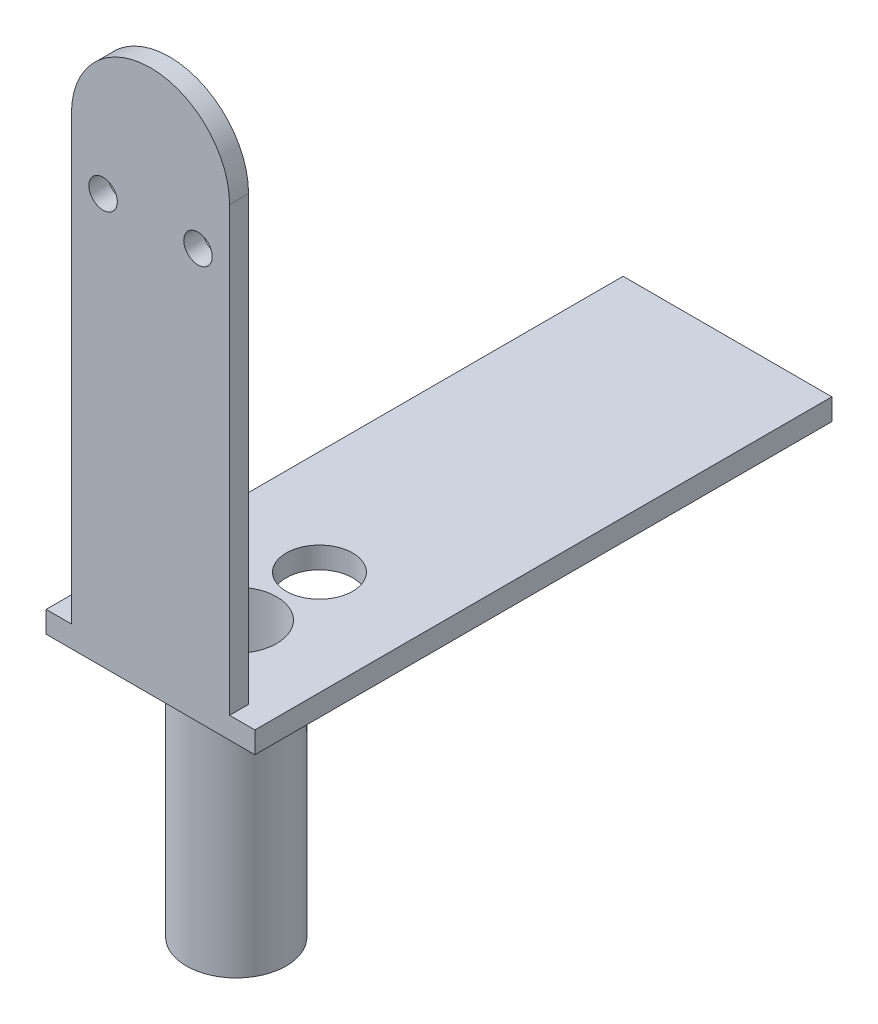
ISO-10303-21;
HEADER;
FILE_DESCRIPTION(('STEP AP214'),'2;1');
FILE_NAME('part.step','',(''),(''),'','','');
FILE_SCHEMA(('AUTOMOTIVE_DESIGN { 1 0 10303 214 1 1 1 1 }'));
ENDSEC;
DATA;
#1=APPLICATION_CONTEXT('core data for automotive mechanical design processes');
#2=APPLICATION_PROTOCOL_DEFINITION('international standard','automotive_design',2000,#1);
#3=PRODUCT_CONTEXT('',#1,'mechanical');
#4=PRODUCT('Part','Part','',(#3));
#5=PRODUCT_RELATED_PRODUCT_CATEGORY('part','',(#4));
#6=PRODUCT_DEFINITION_FORMATION('','',#4);
#7=PRODUCT_DEFINITION_CONTEXT('part definition',#1,'design');
#8=PRODUCT_DEFINITION('design','',#6,#7);
#9=PRODUCT_DEFINITION_SHAPE('','',#8);
#10=(LENGTH_UNIT() NAMED_UNIT(*) SI_UNIT(.MILLI.,.METRE.));
#11=(NAMED_UNIT(*) PLANE_ANGLE_UNIT() SI_UNIT($,.RADIAN.));
#12=(NAMED_UNIT(*) SI_UNIT($,.STERADIAN.) SOLID_ANGLE_UNIT());
#13=UNCERTAINTY_MEASURE_WITH_UNIT(LENGTH_MEASURE(1.E-05),#10,'distance_accuracy_value','');
#14=(GEOMETRIC_REPRESENTATION_CONTEXT(3) GLOBAL_UNCERTAINTY_ASSIGNED_CONTEXT((#13)) GLOBAL_UNIT_ASSIGNED_CONTEXT((#10,
#11,#12)) REPRESENTATION_CONTEXT('',''));
#15=CARTESIAN_POINT('',(0.,0.,0.));
#16=DIRECTION('',(0.,0.,1.));
#17=DIRECTION('',(1.,0.,0.));
#18=AXIS2_PLACEMENT_3D('',#15,#16,#17);
#19=CARTESIAN_POINT('',(0.,102.88672710634,0.));
#20=DIRECTION('',(-1.,0.,0.));
#21=DIRECTION('',(0.,0.,1.));
#22=AXIS2_PLACEMENT_3D('',#19,#20,#21);
#23=PLANE('',#22);
#24=DIRECTION('',(0.,0.,1.));
#25=VECTOR('',#24,1.);
#26=CARTESIAN_POINT('',(0.,10.6,0.));
#27=LINE('',#26,#25);
#28=CARTESIAN_POINT('',(0.,10.6,-75.2));
#29=VERTEX_POINT('',#28);
#30=CARTESIAN_POINT('',(0.,10.6,16.));
#31=VERTEX_POINT('',#30);
#32=EDGE_CURVE('E112',#29,#31,#27,.T.);
#33=ORIENTED_EDGE('',*,*,#32,.F.);
#34=DIRECTION('',(0.,1.,0.));
#35=VECTOR('',#34,1.);
#36=CARTESIAN_POINT('',(0.,7.2,-75.2));
#37=LINE('',#36,#35);
#38=CARTESIAN_POINT('',(0.,7.2,-75.2));
#39=VERTEX_POINT('',#38);
#40=EDGE_CURVE('E166',#39,#29,#37,.T.);
#41=ORIENTED_EDGE('',*,*,#40,.F.);
#42=DIRECTION('',(0.,0.,-1.));
#43=VECTOR('',#42,1.);
#44=CARTESIAN_POINT('',(0.,7.2,16.));
#45=LINE('',#44,#43);
#46=CARTESIAN_POINT('',(0.,7.2,16.));
#47=VERTEX_POINT('',#46);
#48=EDGE_CURVE('E140',#47,#39,#45,.T.);
#49=ORIENTED_EDGE('',*,*,#48,.F.);
#50=DIRECTION('',(0.,-1.,0.));
#51=VECTOR('',#50,1.);
#52=CARTESIAN_POINT('',(0.,102.88672710634,16.));
#53=LINE('',#52,#51);
#54=EDGE_CURVE('E118',#31,#47,#53,.T.);
#55=ORIENTED_EDGE('',*,*,#54,.F.);
#56=EDGE_LOOP('',(#33,#41,#49,#55));
#57=FACE_BOUND('',#56,.T.);
#58=ADVANCED_FACE('F37',(#57),#23,.T.);
#59=CARTESIAN_POINT('',(33.,102.88672710634,0.));
#60=DIRECTION('',(-1.,0.,0.));
#61=DIRECTION('',(0.,0.,1.));
#62=AXIS2_PLACEMENT_3D('',#59,#60,#61);
#63=PLANE('',#62);
#64=DIRECTION('',(0.,-1.,0.));
#65=VECTOR('',#64,1.);
#66=CARTESIAN_POINT('',(33.,10.6,-75.2));
#67=LINE('',#66,#65);
#68=CARTESIAN_POINT('',(33.,10.6,-75.2));
#69=VERTEX_POINT('',#68);
#70=CARTESIAN_POINT('',(33.,7.2,-75.2));
#71=VERTEX_POINT('',#70);
#72=EDGE_CURVE('E53',#69,#71,#67,.T.);
#73=ORIENTED_EDGE('',*,*,#72,.F.);
#74=DIRECTION('',(0.,0.,1.));
#75=VECTOR('',#74,1.);
#76=CARTESIAN_POINT('',(33.,10.6,0.));
#77=LINE('',#76,#75);
#78=CARTESIAN_POINT('',(33.,10.6,16.));
#79=VERTEX_POINT('',#78);
#80=EDGE_CURVE('E129',#69,#79,#77,.T.);
#81=ORIENTED_EDGE('',*,*,#80,.T.);
#82=DIRECTION('',(0.,-1.,0.));
#83=VECTOR('',#82,1.);
#84=CARTESIAN_POINT('',(33.,102.88672710634,16.));
#85=LINE('',#84,#83);
#86=CARTESIAN_POINT('',(33.,7.2,16.));
#87=VERTEX_POINT('',#86);
#88=EDGE_CURVE('E130',#79,#87,#85,.T.);
#89=ORIENTED_EDGE('',*,*,#88,.T.);
#90=DIRECTION('',(0.,0.,1.));
#91=VECTOR('',#90,1.);
#92=CARTESIAN_POINT('',(33.,7.2,-76.1999999999999));
#93=LINE('',#92,#91);
#94=EDGE_CURVE('E146',#71,#87,#93,.T.);
#95=ORIENTED_EDGE('',*,*,#94,.F.);
#96=EDGE_LOOP('',(#73,#81,#89,#95));
#97=FACE_BOUND('',#96,.T.);
#98=ADVANCED_FACE('F235',(#97),#63,.F.);
#99=CARTESIAN_POINT('',(0.,10.6,0.));
#100=DIRECTION('',(0.,-1.,0.));
#101=DIRECTION('',(0.,0.,-1.));
#102=AXIS2_PLACEMENT_3D('',#99,#100,#101);
#103=PLANE('',#102);
#104=CARTESIAN_POINT('',(16.5,10.6,-10.7));
#105=DIRECTION('',(0.,-1.,0.));
#106=DIRECTION('',(0.,0.,-1.));
#107=AXIS2_PLACEMENT_3D('',#104,#105,#106);
#108=CIRCLE('',#107,5.25);
#109=CARTESIAN_POINT('',(16.5,10.6,-15.95));
#110=VERTEX_POINT('',#109);
#111=EDGE_CURVE('E133',#110,#110,#108,.F.);
#112=ORIENTED_EDGE('',*,*,#111,.F.);
#113=EDGE_LOOP('',(#112));
#114=FACE_BOUND('',#113,.T.);
#115=CARTESIAN_POINT('',(16.5,10.6,2.45));
#116=DIRECTION('',(0.,-1.,0.));
#117=DIRECTION('',(0.,0.,-1.));
#118=AXIS2_PLACEMENT_3D('',#115,#116,#117);
#119=CIRCLE('',#118,6.4);
#120=CARTESIAN_POINT('',(16.5,10.6,-3.95));
#121=VERTEX_POINT('',#120);
#122=EDGE_CURVE('E154',#121,#121,#119,.F.);
#123=ORIENTED_EDGE('',*,*,#122,.F.);
#124=EDGE_LOOP('',(#123));
#125=FACE_BOUND('',#124,.T.);
#126=DIRECTION('',(1.,0.,0.));
#127=VECTOR('',#126,1.);
#128=CARTESIAN_POINT('',(0.,10.6,-75.2));
#129=LINE('',#128,#127);
#130=EDGE_CURVE('E164',#29,#69,#129,.T.);
#131=ORIENTED_EDGE('',*,*,#130,.F.);
#132=ORIENTED_EDGE('',*,*,#32,.T.);
#133=DIRECTION('',(1.,0.,0.));
#134=VECTOR('',#133,1.);
#135=CARTESIAN_POINT('',(0.,10.6,16.));
#136=LINE('',#135,#134);
#137=CARTESIAN_POINT('',(4.,10.6,16.));
#138=VERTEX_POINT('',#137);
#139=EDGE_CURVE('E117',#31,#138,#136,.T.);
#140=ORIENTED_EDGE('',*,*,#139,.T.);
#141=DIRECTION('',(0.,0.,1.));
#142=VECTOR('',#141,1.);
#143=CARTESIAN_POINT('',(4.,10.6,0.));
#144=LINE('',#143,#142);
#145=CARTESIAN_POINT('',(4.,10.6,13.));
#146=VERTEX_POINT('',#145);
#147=EDGE_CURVE('E115',#146,#138,#144,.T.);
#148=ORIENTED_EDGE('',*,*,#147,.F.);
#149=DIRECTION('',(1.,0.,0.));
#150=VECTOR('',#149,1.);
#151=CARTESIAN_POINT('',(0.,10.6,13.));
#152=LINE('',#151,#150);
#153=CARTESIAN_POINT('',(29.,10.6,13.));
#154=VERTEX_POINT('',#153);
#155=EDGE_CURVE('E88',#146,#154,#152,.T.);
#156=ORIENTED_EDGE('',*,*,#155,.T.);
#157=DIRECTION('',(0.,0.,-1.));
#158=VECTOR('',#157,1.);
#159=CARTESIAN_POINT('',(29.,10.6,0.));
#160=LINE('',#159,#158);
#161=CARTESIAN_POINT('',(29.,10.6,16.));
#162=VERTEX_POINT('',#161);
#163=EDGE_CURVE('E126',#162,#154,#160,.T.);
#164=ORIENTED_EDGE('',*,*,#163,.F.);
#165=DIRECTION('',(-1.,0.,0.));
#166=VECTOR('',#165,1.);
#167=CARTESIAN_POINT('',(0.,10.6,16.));
#168=LINE('',#167,#166);
#169=EDGE_CURVE('E121',#79,#162,#168,.T.);
#170=ORIENTED_EDGE('',*,*,#169,.F.);
#171=ORIENTED_EDGE('',*,*,#80,.F.);
#172=EDGE_LOOP('',(#131,#132,#140,#148,#156,#164,#170,#171));
#173=FACE_BOUND('',#172,.T.);
#174=ADVANCED_FACE('F180',(#114,#125,#173),#103,.F.);
#175=CARTESIAN_POINT('',(0.,7.2,0.));
#176=DIRECTION('',(0.,-1.,0.));
#177=DIRECTION('',(0.,0.,-1.));
#178=AXIS2_PLACEMENT_3D('',#175,#176,#177);
#179=PLANE('',#178);
#180=CARTESIAN_POINT('',(16.5,7.2,-10.7));
#181=DIRECTION('',(0.,-1.,0.));
#182=DIRECTION('',(0.,0.,-1.));
#183=AXIS2_PLACEMENT_3D('',#180,#181,#182);
#184=CIRCLE('',#183,5.25);
#185=CARTESIAN_POINT('',(16.5,7.2,-5.45));
#186=VERTEX_POINT('',#185);
#187=EDGE_CURVE('E41',#186,#186,#184,.F.);
#188=ORIENTED_EDGE('',*,*,#187,.T.);
#189=CARTESIAN_POINT('',(16.5,7.2,2.45));
#190=DIRECTION('',(0.,-1.,0.));
#191=DIRECTION('',(0.,0.,-1.));
#192=AXIS2_PLACEMENT_3D('',#189,#190,#191);
#193=CIRCLE('',#192,7.9);
#194=EDGE_CURVE('E150',#186,#186,#193,.T.);
#195=ORIENTED_EDGE('',*,*,#194,.F.);
#196=EDGE_LOOP('',(#188,#195));
#197=FACE_BOUND('',#196,.T.);
#198=ORIENTED_EDGE('',*,*,#48,.T.);
#199=DIRECTION('',(-1.,0.,0.));
#200=VECTOR('',#199,1.);
#201=CARTESIAN_POINT('',(33.,7.2,-75.2));
#202=LINE('',#201,#200);
#203=EDGE_CURVE('E161',#71,#39,#202,.T.);
#204=ORIENTED_EDGE('',*,*,#203,.F.);
#205=ORIENTED_EDGE('',*,*,#94,.T.);
#206=DIRECTION('',(-1.,0.,0.));
#207=VECTOR('',#206,1.);
#208=CARTESIAN_POINT('',(33.,7.2,16.));
#209=LINE('',#208,#207);
#210=EDGE_CURVE('E143',#87,#47,#209,.T.);
#211=ORIENTED_EDGE('',*,*,#210,.T.);
#212=EDGE_LOOP('',(#198,#204,#205,#211));
#213=FACE_BOUND('',#212,.T.);
#214=ADVANCED_FACE('F213',(#197,#213),#179,.T.);
#215=CARTESIAN_POINT('',(0.,0.,16.));
#216=DIRECTION('',(0.,0.,1.));
#217=DIRECTION('',(1.,0.,0.));
#218=AXIS2_PLACEMENT_3D('',#215,#216,#217);
#219=PLANE('',#218);
#220=CARTESIAN_POINT('',(9.,72.,16.));
#221=DIRECTION('',(0.,0.,1.));
#222=DIRECTION('',(1.,0.,0.));
#223=AXIS2_PLACEMENT_3D('',#220,#221,#222);
#224=CIRCLE('',#223,2.25);
#225=CARTESIAN_POINT('',(6.75,72.,16.));
#226=VERTEX_POINT('',#225);
#227=EDGE_CURVE('E105',#226,#226,#224,.T.);
#228=ORIENTED_EDGE('',*,*,#227,.F.);
#229=EDGE_LOOP('',(#228));
#230=FACE_BOUND('',#229,.T.);
#231=CARTESIAN_POINT('',(24.,72.,16.));
#232=DIRECTION('',(0.,0.,1.));
#233=DIRECTION('',(1.,0.,0.));
#234=AXIS2_PLACEMENT_3D('',#231,#232,#233);
#235=CIRCLE('',#234,2.25);
#236=CARTESIAN_POINT('',(21.75,72.,16.));
#237=VERTEX_POINT('',#236);
#238=EDGE_CURVE('E89',#237,#237,#235,.F.);
#239=ORIENTED_EDGE('',*,*,#238,.T.);
#240=EDGE_LOOP('',(#239));
#241=FACE_BOUND('',#240,.T.);
#242=ORIENTED_EDGE('',*,*,#54,.T.);
#243=ORIENTED_EDGE('',*,*,#210,.F.);
#244=ORIENTED_EDGE('',*,*,#88,.F.);
#245=ORIENTED_EDGE('',*,*,#169,.T.);
#246=DIRECTION('',(0.,-1.,0.));
#247=VECTOR('',#246,1.);
#248=CARTESIAN_POINT('',(29.,0.,16.));
#249=LINE('',#248,#247);
#250=CARTESIAN_POINT('',(29.,80.5,16.));
#251=VERTEX_POINT('',#250);
#252=EDGE_CURVE('E95',#251,#162,#249,.T.);
#253=ORIENTED_EDGE('',*,*,#252,.F.);
#254=CARTESIAN_POINT('',(16.5,80.5,16.));
#255=DIRECTION('',(0.,0.,1.));
#256=DIRECTION('',(1.,0.,0.));
#257=AXIS2_PLACEMENT_3D('',#254,#255,#256);
#258=CIRCLE('',#257,12.5);
#259=CARTESIAN_POINT('',(4.,80.5,16.));
#260=VERTEX_POINT('',#259);
#261=EDGE_CURVE('E78',#260,#251,#258,.F.);
#262=ORIENTED_EDGE('',*,*,#261,.F.);
#263=DIRECTION('',(0.,1.,0.));
#264=VECTOR('',#263,1.);
#265=CARTESIAN_POINT('',(4.,0.,16.));
#266=LINE('',#265,#264);
#267=EDGE_CURVE('E62',#138,#260,#266,.T.);
#268=ORIENTED_EDGE('',*,*,#267,.F.);
#269=ORIENTED_EDGE('',*,*,#139,.F.);
#270=EDGE_LOOP('',(#242,#243,#244,#245,#253,#262,#268,#269));
#271=FACE_BOUND('',#270,.T.);
#272=ADVANCED_FACE('F190',(#230,#241,#271),#219,.T.);
#273=CARTESIAN_POINT('',(16.5,25.4492424049175,-10.7));
#274=DIRECTION('',(0.,-1.,0.));
#275=DIRECTION('',(0.,0.,-1.));
#276=AXIS2_PLACEMENT_3D('',#273,#274,#275);
#277=CYLINDRICAL_SURFACE('',#276,5.25);
#278=ORIENTED_EDGE('',*,*,#111,.T.);
#279=EDGE_LOOP('',(#278));
#280=FACE_BOUND('',#279,.T.);
#281=ORIENTED_EDGE('',*,*,#187,.F.);
#282=EDGE_LOOP('',(#281));
#283=FACE_BOUND('',#282,.T.);
#284=ADVANCED_FACE('F210',(#280,#283),#277,.F.);
#285=CARTESIAN_POINT('',(29.,0.,16.));
#286=DIRECTION('',(1.,0.,0.));
#287=DIRECTION('',(0.,0.,-1.));
#288=AXIS2_PLACEMENT_3D('',#285,#286,#287);
#289=PLANE('',#288);
#290=ORIENTED_EDGE('',*,*,#252,.T.);
#291=ORIENTED_EDGE('',*,*,#163,.T.);
#292=DIRECTION('',(0.,-1.,0.));
#293=VECTOR('',#292,1.);
#294=CARTESIAN_POINT('',(29.,0.,13.));
#295=LINE('',#294,#293);
#296=CARTESIAN_POINT('',(29.,80.5,13.));
#297=VERTEX_POINT('',#296);
#298=EDGE_CURVE('E93',#297,#154,#295,.T.);
#299=ORIENTED_EDGE('',*,*,#298,.F.);
#300=DIRECTION('',(0.,0.,-1.));
#301=VECTOR('',#300,1.);
#302=CARTESIAN_POINT('',(29.,80.5,16.));
#303=LINE('',#302,#301);
#304=EDGE_CURVE('E11',#251,#297,#303,.T.);
#305=ORIENTED_EDGE('',*,*,#304,.F.);
#306=EDGE_LOOP('',(#290,#291,#299,#305));
#307=FACE_BOUND('',#306,.T.);
#308=ADVANCED_FACE('F258',(#307),#289,.T.);
#309=CARTESIAN_POINT('',(4.,0.,16.));
#310=DIRECTION('',(-1.,0.,0.));
#311=DIRECTION('',(0.,0.,1.));
#312=AXIS2_PLACEMENT_3D('',#309,#310,#311);
#313=PLANE('',#312);
#314=DIRECTION('',(0.,1.,0.));
#315=VECTOR('',#314,1.);
#316=CARTESIAN_POINT('',(4.,0.,13.));
#317=LINE('',#316,#315);
#318=CARTESIAN_POINT('',(4.,80.5,13.));
#319=VERTEX_POINT('',#318);
#320=EDGE_CURVE('E73',#146,#319,#317,.T.);
#321=ORIENTED_EDGE('',*,*,#320,.F.);
#322=ORIENTED_EDGE('',*,*,#147,.T.);
#323=ORIENTED_EDGE('',*,*,#267,.T.);
#324=DIRECTION('',(0.,0.,-1.));
#325=VECTOR('',#324,1.);
#326=CARTESIAN_POINT('',(4.,80.5,16.));
#327=LINE('',#326,#325);
#328=EDGE_CURVE('E46',#260,#319,#327,.T.);
#329=ORIENTED_EDGE('',*,*,#328,.T.);
#330=EDGE_LOOP('',(#321,#322,#323,#329));
#331=FACE_BOUND('',#330,.T.);
#332=ADVANCED_FACE('F39',(#331),#313,.T.);
#333=CARTESIAN_POINT('',(0.,0.,13.));
#334=DIRECTION('',(0.,0.,1.));
#335=DIRECTION('',(1.,0.,0.));
#336=AXIS2_PLACEMENT_3D('',#333,#334,#335);
#337=PLANE('',#336);
#338=CARTESIAN_POINT('',(9.,72.,13.));
#339=DIRECTION('',(0.,0.,-1.));
#340=DIRECTION('',(-1.,0.,0.));
#341=AXIS2_PLACEMENT_3D('',#338,#339,#340);
#342=CIRCLE('',#341,2.25);
#343=CARTESIAN_POINT('',(6.75,72.,13.));
#344=VERTEX_POINT('',#343);
#345=EDGE_CURVE('E109',#344,#344,#342,.T.);
#346=ORIENTED_EDGE('',*,*,#345,.F.);
#347=EDGE_LOOP('',(#346));
#348=FACE_BOUND('',#347,.T.);
#349=ORIENTED_EDGE('',*,*,#320,.T.);
#350=CARTESIAN_POINT('',(16.5,80.5,13.));
#351=DIRECTION('',(0.,0.,1.));
#352=DIRECTION('',(1.,0.,0.));
#353=AXIS2_PLACEMENT_3D('',#350,#351,#352);
#354=CIRCLE('',#353,12.5);
#355=EDGE_CURVE('E86',#319,#297,#354,.F.);
#356=ORIENTED_EDGE('',*,*,#355,.T.);
#357=ORIENTED_EDGE('',*,*,#298,.T.);
#358=ORIENTED_EDGE('',*,*,#155,.F.);
#359=EDGE_LOOP('',(#349,#356,#357,#358));
#360=FACE_BOUND('',#359,.T.);
#361=CARTESIAN_POINT('',(24.,72.,13.));
#362=DIRECTION('',(0.,0.,-1.));
#363=DIRECTION('',(-1.,0.,0.));
#364=AXIS2_PLACEMENT_3D('',#361,#362,#363);
#365=CIRCLE('',#364,2.25);
#366=CARTESIAN_POINT('',(21.75,72.,13.));
#367=VERTEX_POINT('',#366);
#368=EDGE_CURVE('E108',#367,#367,#365,.F.);
#369=ORIENTED_EDGE('',*,*,#368,.T.);
#370=EDGE_LOOP('',(#369));
#371=FACE_BOUND('',#370,.T.);
#372=ADVANCED_FACE('F83',(#348,#360,#371),#337,.F.);
#373=CARTESIAN_POINT('',(16.5,80.5,16.));
#374=DIRECTION('',(0.,0.,-1.));
#375=DIRECTION('',(-1.,0.,0.));
#376=AXIS2_PLACEMENT_3D('',#373,#374,#375);
#377=CYLINDRICAL_SURFACE('',#376,12.5);
#378=ORIENTED_EDGE('',*,*,#355,.F.);
#379=ORIENTED_EDGE('',*,*,#328,.F.);
#380=ORIENTED_EDGE('',*,*,#261,.T.);
#381=ORIENTED_EDGE('',*,*,#304,.T.);
#382=EDGE_LOOP('',(#378,#379,#380,#381));
#383=FACE_BOUND('',#382,.T.);
#384=ADVANCED_FACE('F91',(#383),#377,.T.);
#385=CARTESIAN_POINT('',(9.,72.,27.));
#386=DIRECTION('',(0.,0.,-1.));
#387=DIRECTION('',(-1.,0.,0.));
#388=AXIS2_PLACEMENT_3D('',#385,#386,#387);
#389=CYLINDRICAL_SURFACE('',#388,2.25);
#390=CARTESIAN_POINT('',(6.75,72.,16.));
#391=CARTESIAN_POINT('',(6.75,72.,15.96875));
#392=CARTESIAN_POINT('',(6.75,72.,15.9375));
#393=CARTESIAN_POINT('',(6.75,72.,15.875));
#394=CARTESIAN_POINT('',(6.75,72.,15.84375));
#395=CARTESIAN_POINT('',(6.75,72.,15.78125));
#396=CARTESIAN_POINT('',(6.75,72.,15.75));
#397=CARTESIAN_POINT('',(6.75,72.,15.6875));
#398=CARTESIAN_POINT('',(6.75,72.,15.65625));
#399=CARTESIAN_POINT('',(6.75,72.,15.59375));
#400=CARTESIAN_POINT('',(6.75,72.,15.5625));
#401=CARTESIAN_POINT('',(6.75,72.,15.5));
#402=CARTESIAN_POINT('',(6.75,72.,15.46875));
#403=CARTESIAN_POINT('',(6.75,72.,15.40625));
#404=CARTESIAN_POINT('',(6.75,72.,15.375));
#405=CARTESIAN_POINT('',(6.75,72.,15.3125));
#406=CARTESIAN_POINT('',(6.75,72.,15.28125));
#407=CARTESIAN_POINT('',(6.75,72.,15.21875));
#408=CARTESIAN_POINT('',(6.75,72.,15.1875));
#409=CARTESIAN_POINT('',(6.75,72.,15.125));
#410=CARTESIAN_POINT('',(6.75,72.,15.09375));
#411=CARTESIAN_POINT('',(6.75,72.,15.03125));
#412=CARTESIAN_POINT('',(6.75,72.,15.));
#413=CARTESIAN_POINT('',(6.75,72.,14.9375));
#414=CARTESIAN_POINT('',(6.75,72.,14.90625));
#415=CARTESIAN_POINT('',(6.75,72.,14.84375));
#416=CARTESIAN_POINT('',(6.75,72.,14.8125));
#417=CARTESIAN_POINT('',(6.75,72.,14.75));
#418=CARTESIAN_POINT('',(6.75,72.,14.71875));
#419=CARTESIAN_POINT('',(6.75,72.,14.65625));
#420=CARTESIAN_POINT('',(6.75,72.,14.625));
#421=CARTESIAN_POINT('',(6.75,72.,14.5625));
#422=CARTESIAN_POINT('',(6.75,72.,14.53125));
#423=CARTESIAN_POINT('',(6.75,72.,14.46875));
#424=CARTESIAN_POINT('',(6.75,72.,14.4375));
#425=CARTESIAN_POINT('',(6.75,72.,14.375));
#426=CARTESIAN_POINT('',(6.75,72.,14.34375));
#427=CARTESIAN_POINT('',(6.75,72.,14.28125));
#428=CARTESIAN_POINT('',(6.75,72.,14.25));
#429=CARTESIAN_POINT('',(6.75,72.,14.1875));
#430=CARTESIAN_POINT('',(6.75,72.,14.15625));
#431=CARTESIAN_POINT('',(6.75,72.,14.09375));
#432=CARTESIAN_POINT('',(6.75,72.,14.0625));
#433=CARTESIAN_POINT('',(6.75,72.,14.));
#434=CARTESIAN_POINT('',(6.75,72.,13.96875));
#435=CARTESIAN_POINT('',(6.75,72.,13.90625));
#436=CARTESIAN_POINT('',(6.75,72.,13.875));
#437=CARTESIAN_POINT('',(6.75,72.,13.8125));
#438=CARTESIAN_POINT('',(6.75,72.,13.78125));
#439=CARTESIAN_POINT('',(6.75,72.,13.71875));
#440=CARTESIAN_POINT('',(6.75,72.,13.6875));
#441=CARTESIAN_POINT('',(6.75,72.,13.625));
#442=CARTESIAN_POINT('',(6.75,72.,13.59375));
#443=CARTESIAN_POINT('',(6.75,72.,13.53125));
#444=CARTESIAN_POINT('',(6.75,72.,13.5));
#445=CARTESIAN_POINT('',(6.75,72.,13.4375));
#446=CARTESIAN_POINT('',(6.75,72.,13.40625));
#447=CARTESIAN_POINT('',(6.75,72.,13.34375));
#448=CARTESIAN_POINT('',(6.75,72.,13.3125));
#449=CARTESIAN_POINT('',(6.75,72.,13.25));
#450=CARTESIAN_POINT('',(6.75,72.,13.21875));
#451=CARTESIAN_POINT('',(6.75,72.,13.15625));
#452=CARTESIAN_POINT('',(6.75,72.,13.125));
#453=CARTESIAN_POINT('',(6.75,72.,13.0625));
#454=CARTESIAN_POINT('',(6.75,72.,13.03125));
#455=CARTESIAN_POINT('',(6.75,72.,13.));
#456=B_SPLINE_CURVE_WITH_KNOTS('',3,(#390,#391,#392,#393,#394,#395,#396,#397,#398,#399,#400,
#401,#402,#403,#404,#405,#406,#407,#408,#409,#410,#411,#412,#413,#414,#415,#416,#417,#418,#419,
#420,#421,#422,#423,#424,#425,#426,#427,#428,#429,#430,#431,#432,#433,#434,#435,#436,#437,#438,
#439,#440,#441,#442,#443,#444,#445,#446,#447,#448,#449,#450,#451,#452,#453,#454,#455),
.UNSPECIFIED.,.F.,.F.,(4,2,2,2,2,2,2,2,2,2,2,2,2,2,2,2,2,2,2,2,2,2,2,2,2,2,2,2,2,2,2,2,4),(0.,
0.0937500000000036,0.1875,0.281250000000004,0.375000000000002,0.468750000000002,
0.562500000000002,0.656250000000002,0.750000000000002,0.843750000000001,0.937500000000001,
1.03125,1.125,1.21875,1.3125,1.40625,1.5,1.59375,1.6875,1.78125,1.875,1.96875,2.0625,2.15625,
2.25,2.34375,2.4375,2.53125,2.625,2.71875,2.8125,2.90625,3.),.UNSPECIFIED.);
#457=EDGE_CURVE('BSEAM229',#226,#344,#456,.T.);
#458=ORIENTED_EDGE('',*,*,#227,.T.);
#459=ORIENTED_EDGE('',*,*,#345,.T.);
#460=ORIENTED_EDGE('',*,*,#457,.T.);
#461=ORIENTED_EDGE('',*,*,#457,.F.);
#462=EDGE_LOOP('',(#458,#460,#459,#461));
#463=FACE_BOUND('',#462,.T.);
#464=ADVANCED_FACE('F229',(#463),#389,.F.);
#465=CARTESIAN_POINT('',(24.,72.,27.));
#466=DIRECTION('',(0.,0.,-1.));
#467=DIRECTION('',(-1.,0.,0.));
#468=AXIS2_PLACEMENT_3D('',#465,#466,#467);
#469=CYLINDRICAL_SURFACE('',#468,2.25);
#470=CARTESIAN_POINT('',(21.75,72.,16.));
#471=CARTESIAN_POINT('',(21.75,72.,15.96875));
#472=CARTESIAN_POINT('',(21.75,72.,15.9375));
#473=CARTESIAN_POINT('',(21.75,72.,15.875));
#474=CARTESIAN_POINT('',(21.75,72.,15.84375));
#475=CARTESIAN_POINT('',(21.75,72.,15.78125));
#476=CARTESIAN_POINT('',(21.75,72.,15.75));
#477=CARTESIAN_POINT('',(21.75,72.,15.6875));
#478=CARTESIAN_POINT('',(21.75,72.,15.65625));
#479=CARTESIAN_POINT('',(21.75,72.,15.59375));
#480=CARTESIAN_POINT('',(21.75,72.,15.5625));
#481=CARTESIAN_POINT('',(21.75,72.,15.5));
#482=CARTESIAN_POINT('',(21.75,72.,15.46875));
#483=CARTESIAN_POINT('',(21.75,72.,15.40625));
#484=CARTESIAN_POINT('',(21.75,72.,15.375));
#485=CARTESIAN_POINT('',(21.75,72.,15.3125));
#486=CARTESIAN_POINT('',(21.75,72.,15.28125));
#487=CARTESIAN_POINT('',(21.75,72.,15.21875));
#488=CARTESIAN_POINT('',(21.75,72.,15.1875));
#489=CARTESIAN_POINT('',(21.75,72.,15.125));
#490=CARTESIAN_POINT('',(21.75,72.,15.09375));
#491=CARTESIAN_POINT('',(21.75,72.,15.03125));
#492=CARTESIAN_POINT('',(21.75,72.,15.));
#493=CARTESIAN_POINT('',(21.75,72.,14.9375));
#494=CARTESIAN_POINT('',(21.75,72.,14.90625));
#495=CARTESIAN_POINT('',(21.75,72.,14.84375));
#496=CARTESIAN_POINT('',(21.75,72.,14.8125));
#497=CARTESIAN_POINT('',(21.75,72.,14.75));
#498=CARTESIAN_POINT('',(21.75,72.,14.71875));
#499=CARTESIAN_POINT('',(21.75,72.,14.65625));
#500=CARTESIAN_POINT('',(21.75,72.,14.625));
#501=CARTESIAN_POINT('',(21.75,72.,14.5625));
#502=CARTESIAN_POINT('',(21.75,72.,14.53125));
#503=CARTESIAN_POINT('',(21.75,72.,14.46875));
#504=CARTESIAN_POINT('',(21.75,72.,14.4375));
#505=CARTESIAN_POINT('',(21.75,72.,14.375));
#506=CARTESIAN_POINT('',(21.75,72.,14.34375));
#507=CARTESIAN_POINT('',(21.75,72.,14.28125));
#508=CARTESIAN_POINT('',(21.75,72.,14.25));
#509=CARTESIAN_POINT('',(21.75,72.,14.1875));
#510=CARTESIAN_POINT('',(21.75,72.,14.15625));
#511=CARTESIAN_POINT('',(21.75,72.,14.09375));
#512=CARTESIAN_POINT('',(21.75,72.,14.0625));
#513=CARTESIAN_POINT('',(21.75,72.,14.));
#514=CARTESIAN_POINT('',(21.75,72.,13.96875));
#515=CARTESIAN_POINT('',(21.75,72.,13.90625));
#516=CARTESIAN_POINT('',(21.75,72.,13.875));
#517=CARTESIAN_POINT('',(21.75,72.,13.8125));
#518=CARTESIAN_POINT('',(21.75,72.,13.78125));
#519=CARTESIAN_POINT('',(21.75,72.,13.71875));
#520=CARTESIAN_POINT('',(21.75,72.,13.6875));
#521=CARTESIAN_POINT('',(21.75,72.,13.625));
#522=CARTESIAN_POINT('',(21.75,72.,13.59375));
#523=CARTESIAN_POINT('',(21.75,72.,13.53125));
#524=CARTESIAN_POINT('',(21.75,72.,13.5));
#525=CARTESIAN_POINT('',(21.75,72.,13.4375));
#526=CARTESIAN_POINT('',(21.75,72.,13.40625));
#527=CARTESIAN_POINT('',(21.75,72.,13.34375));
#528=CARTESIAN_POINT('',(21.75,72.,13.3125));
#529=CARTESIAN_POINT('',(21.75,72.,13.25));
#530=CARTESIAN_POINT('',(21.75,72.,13.21875));
#531=CARTESIAN_POINT('',(21.75,72.,13.15625));
#532=CARTESIAN_POINT('',(21.75,72.,13.125));
#533=CARTESIAN_POINT('',(21.75,72.,13.0625));
#534=CARTESIAN_POINT('',(21.75,72.,13.03125));
#535=CARTESIAN_POINT('',(21.75,72.,13.));
#536=B_SPLINE_CURVE_WITH_KNOTS('',3,(#470,#471,#472,#473,#474,#475,#476,#477,#478,#479,#480,
#481,#482,#483,#484,#485,#486,#487,#488,#489,#490,#491,#492,#493,#494,#495,#496,#497,#498,#499,
#500,#501,#502,#503,#504,#505,#506,#507,#508,#509,#510,#511,#512,#513,#514,#515,#516,#517,#518,
#519,#520,#521,#522,#523,#524,#525,#526,#527,#528,#529,#530,#531,#532,#533,#534,#535),
.UNSPECIFIED.,.F.,.F.,(4,2,2,2,2,2,2,2,2,2,2,2,2,2,2,2,2,2,2,2,2,2,2,2,2,2,2,2,2,2,2,2,4),(0.,
0.0937500000000036,0.1875,0.281250000000004,0.375000000000002,0.468750000000002,
0.562500000000002,0.656250000000002,0.750000000000002,0.843750000000001,0.937500000000001,
1.03125,1.125,1.21875,1.3125,1.40625,1.5,1.59375,1.6875,1.78125,1.875,1.96875,2.0625,2.15625,
2.25,2.34375,2.4375,2.53125,2.625,2.71875,2.8125,2.90625,3.),.UNSPECIFIED.);
#537=EDGE_CURVE('BSEAM219',#237,#367,#536,.T.);
#538=ORIENTED_EDGE('',*,*,#238,.F.);
#539=ORIENTED_EDGE('',*,*,#368,.F.);
#540=ORIENTED_EDGE('',*,*,#537,.T.);
#541=ORIENTED_EDGE('',*,*,#537,.F.);
#542=EDGE_LOOP('',(#538,#540,#539,#541));
#543=FACE_BOUND('',#542,.T.);
#544=ADVANCED_FACE('F219',(#543),#469,.F.);
#545=CARTESIAN_POINT('',(16.5,-32.8,2.45));
#546=DIRECTION('',(0.,1.,0.));
#547=DIRECTION('',(0.,0.,1.));
#548=AXIS2_PLACEMENT_3D('',#545,#546,#547);
#549=CYLINDRICAL_SURFACE('',#548,7.9);
#550=CARTESIAN_POINT('',(16.5,-32.8,2.45));
#551=DIRECTION('',(0.,-1.,0.));
#552=DIRECTION('',(0.,0.,-1.));
#553=AXIS2_PLACEMENT_3D('',#550,#551,#552);
#554=CIRCLE('',#553,7.9);
#555=CARTESIAN_POINT('',(16.5,-32.8,-5.45));
#556=VERTEX_POINT('',#555);
#557=EDGE_CURVE('E153',#556,#556,#554,.T.);
#558=ORIENTED_EDGE('',*,*,#557,.F.);
#559=EDGE_LOOP('',(#558));
#560=FACE_BOUND('',#559,.T.);
#561=ORIENTED_EDGE('',*,*,#194,.T.);
#562=EDGE_LOOP('',(#561));
#563=FACE_BOUND('',#562,.T.);
#564=ADVANCED_FACE('F216',(#560,#563),#549,.T.);
#565=CARTESIAN_POINT('',(16.5,-32.8,2.45));
#566=DIRECTION('',(0.,1.,0.));
#567=DIRECTION('',(0.,0.,1.));
#568=AXIS2_PLACEMENT_3D('',#565,#566,#567);
#569=CYLINDRICAL_SURFACE('',#568,6.4);
#570=CARTESIAN_POINT('',(16.5,-32.8,2.45));
#571=DIRECTION('',(0.,-1.,0.));
#572=DIRECTION('',(0.,0.,-1.));
#573=AXIS2_PLACEMENT_3D('',#570,#571,#572);
#574=CIRCLE('',#573,6.4);
#575=CARTESIAN_POINT('',(16.5,-32.8,-3.95));
#576=VERTEX_POINT('',#575);
#577=EDGE_CURVE('E149',#576,#576,#574,.T.);
#578=ORIENTED_EDGE('',*,*,#577,.T.);
#579=EDGE_LOOP('',(#578));
#580=FACE_BOUND('',#579,.T.);
#581=ORIENTED_EDGE('',*,*,#122,.T.);
#582=EDGE_LOOP('',(#581));
#583=FACE_BOUND('',#582,.T.);
#584=ADVANCED_FACE('F218',(#580,#583),#569,.F.);
#585=CARTESIAN_POINT('',(0.,-32.8,0.));
#586=DIRECTION('',(0.,-1.,0.));
#587=DIRECTION('',(0.,0.,-1.));
#588=AXIS2_PLACEMENT_3D('',#585,#586,#587);
#589=PLANE('',#588);
#590=ORIENTED_EDGE('',*,*,#557,.T.);
#591=EDGE_LOOP('',(#590));
#592=FACE_BOUND('',#591,.T.);
#593=ORIENTED_EDGE('',*,*,#577,.F.);
#594=EDGE_LOOP('',(#593));
#595=FACE_BOUND('',#594,.T.);
#596=ADVANCED_FACE('F226',(#592,#595),#589,.T.);
#597=CARTESIAN_POINT('',(0.,0.,-75.2));
#598=DIRECTION('',(0.,0.,-1.));
#599=DIRECTION('',(-1.,0.,0.));
#600=AXIS2_PLACEMENT_3D('',#597,#598,#599);
#601=PLANE('',#600);
#602=ORIENTED_EDGE('',*,*,#40,.T.);
#603=ORIENTED_EDGE('',*,*,#130,.T.);
#604=ORIENTED_EDGE('',*,*,#72,.T.);
#605=ORIENTED_EDGE('',*,*,#203,.T.);
#606=EDGE_LOOP('',(#602,#603,#604,#605));
#607=FACE_BOUND('',#606,.T.);
#608=ADVANCED_FACE('F171',(#607),#601,.T.);
#609=CLOSED_SHELL('',(#58,#98,#174,#214,#272,#284,#308,#332,#372,#384,#464,#544,#564,#584,#596,#608));
#610=MANIFOLD_SOLID_BREP('B2',#609);
#611=ADVANCED_BREP_SHAPE_REPRESENTATION('',(#18,#610),#14);
#612=SHAPE_DEFINITION_REPRESENTATION(#9,#611);
ENDSEC;
END-ISO-10303-21;
